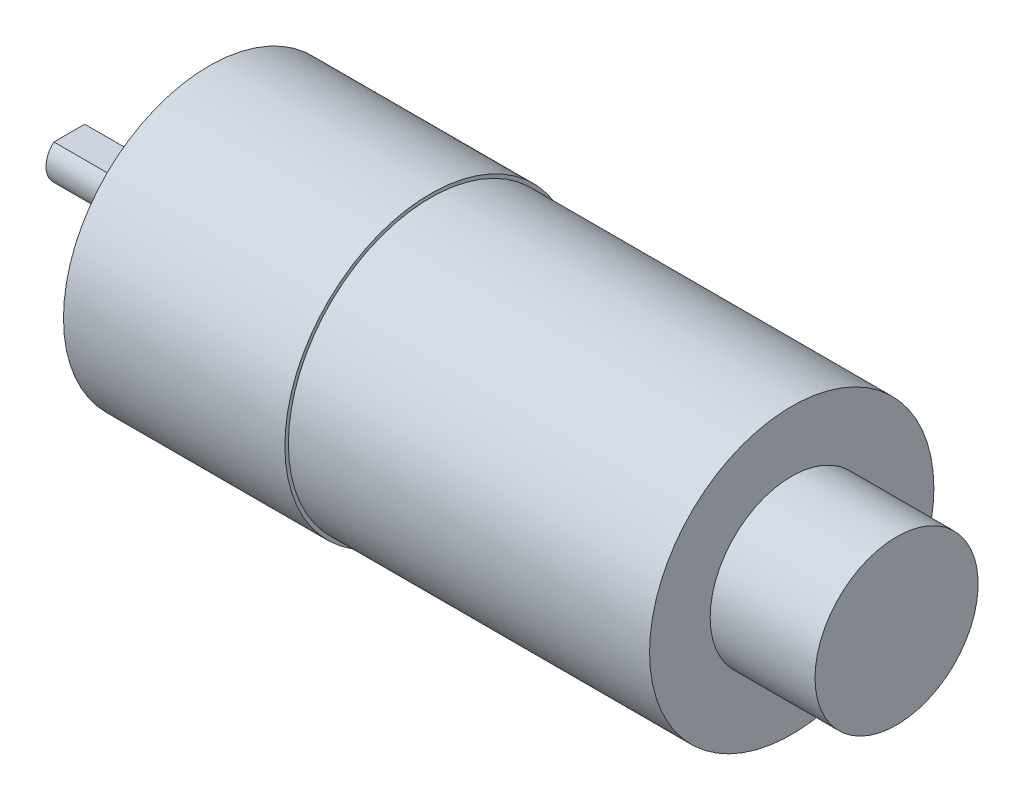
ISO-10303-21;
HEADER;
FILE_DESCRIPTION(('STEP AP214'),'2;1');
FILE_NAME('part.step','',(''),(''),'','','');
FILE_SCHEMA(('AUTOMOTIVE_DESIGN { 1 0 10303 214 1 1 1 1 }'));
ENDSEC;
DATA;
#1=APPLICATION_CONTEXT('core data for automotive mechanical design processes');
#2=APPLICATION_PROTOCOL_DEFINITION('international standard','automotive_design',2000,#1);
#3=PRODUCT_CONTEXT('',#1,'mechanical');
#4=PRODUCT('Part','Part','',(#3));
#5=PRODUCT_RELATED_PRODUCT_CATEGORY('part','',(#4));
#6=PRODUCT_DEFINITION_FORMATION('','',#4);
#7=PRODUCT_DEFINITION_CONTEXT('part definition',#1,'design');
#8=PRODUCT_DEFINITION('design','',#6,#7);
#9=PRODUCT_DEFINITION_SHAPE('','',#8);
#10=(LENGTH_UNIT() NAMED_UNIT(*) SI_UNIT(.MILLI.,.METRE.));
#11=(NAMED_UNIT(*) PLANE_ANGLE_UNIT() SI_UNIT($,.RADIAN.));
#12=(NAMED_UNIT(*) SI_UNIT($,.STERADIAN.) SOLID_ANGLE_UNIT());
#13=UNCERTAINTY_MEASURE_WITH_UNIT(LENGTH_MEASURE(1.E-05),#10,'distance_accuracy_value','');
#14=(GEOMETRIC_REPRESENTATION_CONTEXT(3) GLOBAL_UNCERTAINTY_ASSIGNED_CONTEXT((#13)) GLOBAL_UNIT_ASSIGNED_CONTEXT((#10,
#11,#12)) REPRESENTATION_CONTEXT('',''));
#15=CARTESIAN_POINT('',(0.,0.,0.));
#16=DIRECTION('',(0.,0.,1.));
#17=DIRECTION('',(1.,0.,0.));
#18=AXIS2_PLACEMENT_3D('',#15,#16,#17);
#19=CARTESIAN_POINT('',(-9.5,0.,0.));
#20=DIRECTION('',(1.,0.,0.));
#21=DIRECTION('',(0.,0.,-1.));
#22=AXIS2_PLACEMENT_3D('',#19,#20,#21);
#23=PLANE('',#22);
#24=CARTESIAN_POINT('',(-9.5,0.,0.));
#25=DIRECTION('',(-1.,0.,0.));
#26=DIRECTION('',(0.,0.,1.));
#27=AXIS2_PLACEMENT_3D('',#24,#25,#26);
#28=CIRCLE('',#27,2.);
#29=CARTESIAN_POINT('',(-9.5,1.5,-1.32287565553229));
#30=VERTEX_POINT('',#29);
#31=CARTESIAN_POINT('',(-9.5,1.5,1.32287565553229));
#32=VERTEX_POINT('',#31);
#33=EDGE_CURVE('E71',#30,#32,#28,.T.);
#34=ORIENTED_EDGE('',*,*,#33,.T.);
#35=DIRECTION('',(0.,0.,1.));
#36=VECTOR('',#35,1.);
#37=CARTESIAN_POINT('',(-9.5,1.5,2.));
#38=LINE('',#37,#36);
#39=EDGE_CURVE('E66',#30,#32,#38,.T.);
#40=ORIENTED_EDGE('',*,*,#39,.F.);
#41=EDGE_LOOP('',(#34,#40));
#42=FACE_BOUND('',#41,.T.);
#43=ADVANCED_FACE('F39',(#42),#23,.F.);
#44=CARTESIAN_POINT('',(61.5,0.,0.));
#45=DIRECTION('',(1.,0.,0.));
#46=DIRECTION('',(0.,0.,-1.));
#47=AXIS2_PLACEMENT_3D('',#44,#45,#46);
#48=PLANE('',#47);
#49=CARTESIAN_POINT('',(61.5,0.,0.));
#50=DIRECTION('',(-1.,0.,0.));
#51=DIRECTION('',(0.,0.,1.));
#52=AXIS2_PLACEMENT_3D('',#49,#50,#51);
#53=CIRCLE('',#52,7.);
#54=CARTESIAN_POINT('',(61.5,0.,7.));
#55=VERTEX_POINT('',#54);
#56=EDGE_CURVE('E103',#55,#55,#53,.T.);
#57=ORIENTED_EDGE('',*,*,#56,.F.);
#58=EDGE_LOOP('',(#57));
#59=FACE_BOUND('',#58,.T.);
#60=ADVANCED_FACE('F111',(#59),#48,.T.);
#61=CARTESIAN_POINT('',(0.,0.,0.));
#62=DIRECTION('',(-1.,0.,0.));
#63=DIRECTION('',(0.,0.,1.));
#64=AXIS2_PLACEMENT_3D('',#61,#62,#63);
#65=CYLINDRICAL_SURFACE('',#64,7.);
#66=ORIENTED_EDGE('',*,*,#56,.T.);
#67=EDGE_LOOP('',(#66));
#68=FACE_BOUND('',#67,.T.);
#69=CARTESIAN_POINT('',(52.5,0.,0.));
#70=DIRECTION('',(-1.,0.,0.));
#71=DIRECTION('',(0.,0.,1.));
#72=AXIS2_PLACEMENT_3D('',#69,#70,#71);
#73=CIRCLE('',#72,7.);
#74=CARTESIAN_POINT('',(52.5,0.,7.));
#75=VERTEX_POINT('',#74);
#76=EDGE_CURVE('E100',#75,#75,#73,.T.);
#77=ORIENTED_EDGE('',*,*,#76,.F.);
#78=EDGE_LOOP('',(#77));
#79=FACE_BOUND('',#78,.T.);
#80=ADVANCED_FACE('F108',(#68,#79),#65,.T.);
#81=CARTESIAN_POINT('',(52.5,0.,0.));
#82=DIRECTION('',(1.,0.,0.));
#83=DIRECTION('',(0.,0.,-1.));
#84=AXIS2_PLACEMENT_3D('',#81,#82,#83);
#85=PLANE('',#84);
#86=ORIENTED_EDGE('',*,*,#76,.T.);
#87=EDGE_LOOP('',(#86));
#88=FACE_BOUND('',#87,.T.);
#89=CARTESIAN_POINT('',(52.5,0.,0.));
#90=DIRECTION('',(-1.,0.,0.));
#91=DIRECTION('',(0.,0.,1.));
#92=AXIS2_PLACEMENT_3D('',#89,#90,#91);
#93=CIRCLE('',#92,12.2);
#94=CARTESIAN_POINT('',(52.5,0.,12.2));
#95=VERTEX_POINT('',#94);
#96=EDGE_CURVE('E97',#95,#95,#93,.T.);
#97=ORIENTED_EDGE('',*,*,#96,.F.);
#98=EDGE_LOOP('',(#97));
#99=FACE_BOUND('',#98,.T.);
#100=ADVANCED_FACE('F117',(#88,#99),#85,.T.);
#101=CARTESIAN_POINT('',(0.,0.,0.));
#102=DIRECTION('',(-1.,0.,0.));
#103=DIRECTION('',(0.,0.,1.));
#104=AXIS2_PLACEMENT_3D('',#101,#102,#103);
#105=CYLINDRICAL_SURFACE('',#104,12.2);
#106=ORIENTED_EDGE('',*,*,#96,.T.);
#107=EDGE_LOOP('',(#106));
#108=FACE_BOUND('',#107,.T.);
#109=CARTESIAN_POINT('',(21.5,0.,0.));
#110=DIRECTION('',(-1.,0.,0.));
#111=DIRECTION('',(0.,0.,1.));
#112=AXIS2_PLACEMENT_3D('',#109,#110,#111);
#113=CIRCLE('',#112,12.2);
#114=CARTESIAN_POINT('',(21.5,0.,12.2));
#115=VERTEX_POINT('',#114);
#116=EDGE_CURVE('E94',#115,#115,#113,.T.);
#117=ORIENTED_EDGE('',*,*,#116,.F.);
#118=EDGE_LOOP('',(#117));
#119=FACE_BOUND('',#118,.T.);
#120=ADVANCED_FACE('F122',(#108,#119),#105,.T.);
#121=CARTESIAN_POINT('',(21.5,0.,0.));
#122=DIRECTION('',(1.,0.,0.));
#123=DIRECTION('',(0.,0.,-1.));
#124=AXIS2_PLACEMENT_3D('',#121,#122,#123);
#125=PLANE('',#124);
#126=ORIENTED_EDGE('',*,*,#116,.T.);
#127=EDGE_LOOP('',(#126));
#128=FACE_BOUND('',#127,.T.);
#129=CARTESIAN_POINT('',(21.5,0.,0.));
#130=DIRECTION('',(-1.,0.,0.));
#131=DIRECTION('',(0.,0.,1.));
#132=AXIS2_PLACEMENT_3D('',#129,#130,#131);
#133=CIRCLE('',#132,12.5);
#134=CARTESIAN_POINT('',(21.5,0.,12.5));
#135=VERTEX_POINT('',#134);
#136=EDGE_CURVE('E91',#135,#135,#133,.T.);
#137=ORIENTED_EDGE('',*,*,#136,.F.);
#138=EDGE_LOOP('',(#137));
#139=FACE_BOUND('',#138,.T.);
#140=ADVANCED_FACE('F126',(#128,#139),#125,.T.);
#141=CARTESIAN_POINT('',(0.,0.,0.));
#142=DIRECTION('',(-1.,0.,0.));
#143=DIRECTION('',(0.,0.,1.));
#144=AXIS2_PLACEMENT_3D('',#141,#142,#143);
#145=CYLINDRICAL_SURFACE('',#144,12.5);
#146=ORIENTED_EDGE('',*,*,#136,.T.);
#147=EDGE_LOOP('',(#146));
#148=FACE_BOUND('',#147,.T.);
#149=CARTESIAN_POINT('',(2.5,0.,0.));
#150=DIRECTION('',(-1.,0.,0.));
#151=DIRECTION('',(0.,0.,1.));
#152=AXIS2_PLACEMENT_3D('',#149,#150,#151);
#153=CIRCLE('',#152,12.5);
#154=CARTESIAN_POINT('',(2.5,0.,12.5));
#155=VERTEX_POINT('',#154);
#156=EDGE_CURVE('E88',#155,#155,#153,.T.);
#157=ORIENTED_EDGE('',*,*,#156,.F.);
#158=EDGE_LOOP('',(#157));
#159=FACE_BOUND('',#158,.T.);
#160=ADVANCED_FACE('F130',(#148,#159),#145,.T.);
#161=CARTESIAN_POINT('',(2.5,0.,0.));
#162=DIRECTION('',(-1.,0.,0.));
#163=DIRECTION('',(0.,0.,1.));
#164=AXIS2_PLACEMENT_3D('',#161,#162,#163);
#165=PLANE('',#164);
#166=CARTESIAN_POINT('',(2.5,8.5,0.));
#167=DIRECTION('',(-1.,0.,0.));
#168=DIRECTION('',(0.,0.,1.));
#169=AXIS2_PLACEMENT_3D('',#166,#167,#168);
#170=CIRCLE('',#169,1.25);
#171=CARTESIAN_POINT('',(2.5,8.5,1.25));
#172=VERTEX_POINT('',#171);
#173=EDGE_CURVE('E173',#172,#172,#170,.T.);
#174=ORIENTED_EDGE('',*,*,#173,.F.);
#175=EDGE_LOOP('',(#174));
#176=FACE_BOUND('',#175,.T.);
#177=CARTESIAN_POINT('',(2.5,-8.5,0.));
#178=DIRECTION('',(-1.,0.,0.));
#179=DIRECTION('',(0.,0.,-1.));
#180=AXIS2_PLACEMENT_3D('',#177,#178,#179);
#181=CIRCLE('',#180,1.25);
#182=CARTESIAN_POINT('',(2.5,-8.5,-1.25));
#183=VERTEX_POINT('',#182);
#184=EDGE_CURVE('E181',#183,#183,#181,.T.);
#185=ORIENTED_EDGE('',*,*,#184,.F.);
#186=EDGE_LOOP('',(#185));
#187=FACE_BOUND('',#186,.T.);
#188=ORIENTED_EDGE('',*,*,#156,.T.);
#189=EDGE_LOOP('',(#188));
#190=FACE_BOUND('',#189,.T.);
#191=CARTESIAN_POINT('',(2.5,0.,0.));
#192=DIRECTION('',(-1.,0.,0.));
#193=DIRECTION('',(0.,0.,1.));
#194=AXIS2_PLACEMENT_3D('',#191,#192,#193);
#195=CIRCLE('',#194,3.5);
#196=CARTESIAN_POINT('',(2.5,0.,3.5));
#197=VERTEX_POINT('',#196);
#198=EDGE_CURVE('E85',#197,#197,#195,.T.);
#199=ORIENTED_EDGE('',*,*,#198,.F.);
#200=EDGE_LOOP('',(#199));
#201=FACE_BOUND('',#200,.T.);
#202=ADVANCED_FACE('F134',(#176,#187,#190,#201),#165,.T.);
#203=CARTESIAN_POINT('',(0.,0.,0.));
#204=DIRECTION('',(-1.,0.,0.));
#205=DIRECTION('',(0.,0.,1.));
#206=AXIS2_PLACEMENT_3D('',#203,#204,#205);
#207=CYLINDRICAL_SURFACE('',#206,3.5);
#208=ORIENTED_EDGE('',*,*,#198,.T.);
#209=EDGE_LOOP('',(#208));
#210=FACE_BOUND('',#209,.T.);
#211=CARTESIAN_POINT('',(0.,0.,0.));
#212=DIRECTION('',(-1.,0.,0.));
#213=DIRECTION('',(0.,0.,1.));
#214=AXIS2_PLACEMENT_3D('',#211,#212,#213);
#215=CIRCLE('',#214,3.5);
#216=CARTESIAN_POINT('',(0.,0.,3.5));
#217=VERTEX_POINT('',#216);
#218=EDGE_CURVE('E79',#217,#217,#215,.T.);
#219=ORIENTED_EDGE('',*,*,#218,.F.);
#220=EDGE_LOOP('',(#219));
#221=FACE_BOUND('',#220,.T.);
#222=ADVANCED_FACE('F138',(#210,#221),#207,.T.);
#223=CARTESIAN_POINT('',(0.,0.,0.));
#224=DIRECTION('',(-1.,0.,0.));
#225=DIRECTION('',(0.,0.,1.));
#226=AXIS2_PLACEMENT_3D('',#223,#224,#225);
#227=PLANE('',#226);
#228=ORIENTED_EDGE('',*,*,#218,.T.);
#229=EDGE_LOOP('',(#228));
#230=FACE_BOUND('',#229,.T.);
#231=CARTESIAN_POINT('',(0.,0.,0.));
#232=DIRECTION('',(-1.,0.,0.));
#233=DIRECTION('',(0.,0.,1.));
#234=AXIS2_PLACEMENT_3D('',#231,#232,#233);
#235=CIRCLE('',#234,2.);
#236=CARTESIAN_POINT('',(0.,0.,2.));
#237=VERTEX_POINT('',#236);
#238=EDGE_CURVE('E76',#237,#237,#235,.T.);
#239=ORIENTED_EDGE('',*,*,#238,.F.);
#240=EDGE_LOOP('',(#239));
#241=FACE_BOUND('',#240,.T.);
#242=ADVANCED_FACE('F142',(#230,#241),#227,.T.);
#243=CARTESIAN_POINT('',(0.,0.,0.));
#244=DIRECTION('',(-1.,0.,0.));
#245=DIRECTION('',(0.,0.,1.));
#246=AXIS2_PLACEMENT_3D('',#243,#244,#245);
#247=CYLINDRICAL_SURFACE('',#246,2.);
#248=CARTESIAN_POINT('',(-1.5,0.,0.));
#249=DIRECTION('',(1.,0.,0.));
#250=DIRECTION('',(0.,0.,-1.));
#251=AXIS2_PLACEMENT_3D('',#248,#249,#250);
#252=CIRCLE('',#251,2.);
#253=CARTESIAN_POINT('',(-1.5,1.5,-1.32287565553229));
#254=VERTEX_POINT('',#253);
#255=CARTESIAN_POINT('',(-1.5,1.5,1.32287565553229));
#256=VERTEX_POINT('',#255);
#257=EDGE_CURVE('E56',#254,#256,#252,.T.);
#258=ORIENTED_EDGE('',*,*,#257,.T.);
#259=DIRECTION('',(-1.,0.,0.));
#260=VECTOR('',#259,1.);
#261=CARTESIAN_POINT('',(0.,1.5,1.32287565553229));
#262=LINE('',#261,#260);
#263=EDGE_CURVE('E12',#256,#32,#262,.T.);
#264=ORIENTED_EDGE('',*,*,#263,.T.);
#265=ORIENTED_EDGE('',*,*,#33,.F.);
#266=DIRECTION('',(-1.,0.,0.));
#267=VECTOR('',#266,1.);
#268=CARTESIAN_POINT('',(0.,1.5,-1.32287565553229));
#269=LINE('',#268,#267);
#270=EDGE_CURVE('E46',#30,#254,#269,.F.);
#271=ORIENTED_EDGE('',*,*,#270,.T.);
#272=EDGE_LOOP('',(#258,#264,#265,#271));
#273=FACE_BOUND('',#272,.T.);
#274=ORIENTED_EDGE('',*,*,#238,.T.);
#275=EDGE_LOOP('',(#274));
#276=FACE_BOUND('',#275,.T.);
#277=ADVANCED_FACE('F74',(#273,#276),#247,.T.);
#278=CARTESIAN_POINT('',(-1.5,1.5,2.));
#279=DIRECTION('',(0.,-1.,0.));
#280=DIRECTION('',(0.,0.,-1.));
#281=AXIS2_PLACEMENT_3D('',#278,#279,#280);
#282=PLANE('',#281);
#283=DIRECTION('',(0.,0.,1.));
#284=VECTOR('',#283,1.);
#285=CARTESIAN_POINT('',(-1.5,1.5,2.));
#286=LINE('',#285,#284);
#287=EDGE_CURVE('E52',#254,#256,#286,.T.);
#288=ORIENTED_EDGE('',*,*,#287,.F.);
#289=ORIENTED_EDGE('',*,*,#270,.F.);
#290=ORIENTED_EDGE('',*,*,#39,.T.);
#291=ORIENTED_EDGE('',*,*,#263,.F.);
#292=EDGE_LOOP('',(#288,#289,#290,#291));
#293=FACE_BOUND('',#292,.T.);
#294=ADVANCED_FACE('F65',(#293),#282,.F.);
#295=CARTESIAN_POINT('',(-1.5,0.,0.));
#296=DIRECTION('',(1.,0.,0.));
#297=DIRECTION('',(0.,0.,-1.));
#298=AXIS2_PLACEMENT_3D('',#295,#296,#297);
#299=PLANE('',#298);
#300=ORIENTED_EDGE('',*,*,#287,.T.);
#301=ORIENTED_EDGE('',*,*,#257,.F.);
#302=EDGE_LOOP('',(#300,#301));
#303=FACE_BOUND('',#302,.T.);
#304=ADVANCED_FACE('F151',(#303),#299,.F.);
#305=CARTESIAN_POINT('',(10.5,-8.5,0.));
#306=DIRECTION('',(-1.,0.,0.));
#307=DIRECTION('',(0.,0.,1.));
#308=AXIS2_PLACEMENT_3D('',#305,#306,#307);
#309=CYLINDRICAL_SURFACE('',#308,1.25);
#310=CARTESIAN_POINT('',(10.5,-8.5,0.));
#311=DIRECTION('',(-1.,0.,0.));
#312=DIRECTION('',(0.,0.,-1.));
#313=AXIS2_PLACEMENT_3D('',#310,#311,#312);
#314=CIRCLE('',#313,1.25);
#315=CARTESIAN_POINT('',(10.5,-8.5,-1.25));
#316=VERTEX_POINT('',#315);
#317=EDGE_CURVE('E176',#316,#316,#314,.T.);
#318=ORIENTED_EDGE('',*,*,#317,.F.);
#319=EDGE_LOOP('',(#318));
#320=FACE_BOUND('',#319,.T.);
#321=ORIENTED_EDGE('',*,*,#184,.T.);
#322=EDGE_LOOP('',(#321));
#323=FACE_BOUND('',#322,.T.);
#324=ADVANCED_FACE('F154',(#320,#323),#309,.F.);
#325=CARTESIAN_POINT('',(10.5,-8.5,0.));
#326=DIRECTION('',(1.,0.,0.));
#327=DIRECTION('',(0.,0.,-1.));
#328=AXIS2_PLACEMENT_3D('',#325,#326,#327);
#329=PLANE('',#328);
#330=ORIENTED_EDGE('',*,*,#317,.T.);
#331=EDGE_LOOP('',(#330));
#332=FACE_BOUND('',#331,.T.);
#333=ADVANCED_FACE('F157',(#332),#329,.F.);
#334=CARTESIAN_POINT('',(10.5,8.5,0.));
#335=DIRECTION('',(-1.,0.,0.));
#336=DIRECTION('',(0.,0.,1.));
#337=AXIS2_PLACEMENT_3D('',#334,#335,#336);
#338=CYLINDRICAL_SURFACE('',#337,1.25);
#339=CARTESIAN_POINT('',(10.5,8.5,0.));
#340=DIRECTION('',(-1.,0.,0.));
#341=DIRECTION('',(0.,0.,1.));
#342=AXIS2_PLACEMENT_3D('',#339,#340,#341);
#343=CIRCLE('',#342,1.25);
#344=CARTESIAN_POINT('',(10.5,8.5,1.25));
#345=VERTEX_POINT('',#344);
#346=EDGE_CURVE('E72',#345,#345,#343,.T.);
#347=ORIENTED_EDGE('',*,*,#346,.F.);
#348=EDGE_LOOP('',(#347));
#349=FACE_BOUND('',#348,.T.);
#350=ORIENTED_EDGE('',*,*,#173,.T.);
#351=EDGE_LOOP('',(#350));
#352=FACE_BOUND('',#351,.T.);
#353=ADVANCED_FACE('F161',(#349,#352),#338,.F.);
#354=CARTESIAN_POINT('',(10.5,8.5,0.));
#355=DIRECTION('',(-1.,0.,0.));
#356=DIRECTION('',(0.,0.,1.));
#357=AXIS2_PLACEMENT_3D('',#354,#355,#356);
#358=PLANE('',#357);
#359=ORIENTED_EDGE('',*,*,#346,.T.);
#360=EDGE_LOOP('',(#359));
#361=FACE_BOUND('',#360,.T.);
#362=ADVANCED_FACE('F165',(#361),#358,.T.);
#363=CLOSED_SHELL('',(#43,#60,#80,#100,#120,#140,#160,#202,#222,#242,#277,#294,#304,#324,#333,
#353,#362));
#364=MANIFOLD_SOLID_BREP('B2',#363);
#365=ADVANCED_BREP_SHAPE_REPRESENTATION('',(#18,#364),#14);
#366=SHAPE_DEFINITION_REPRESENTATION(#9,#365);
ENDSEC;
END-ISO-10303-21;
